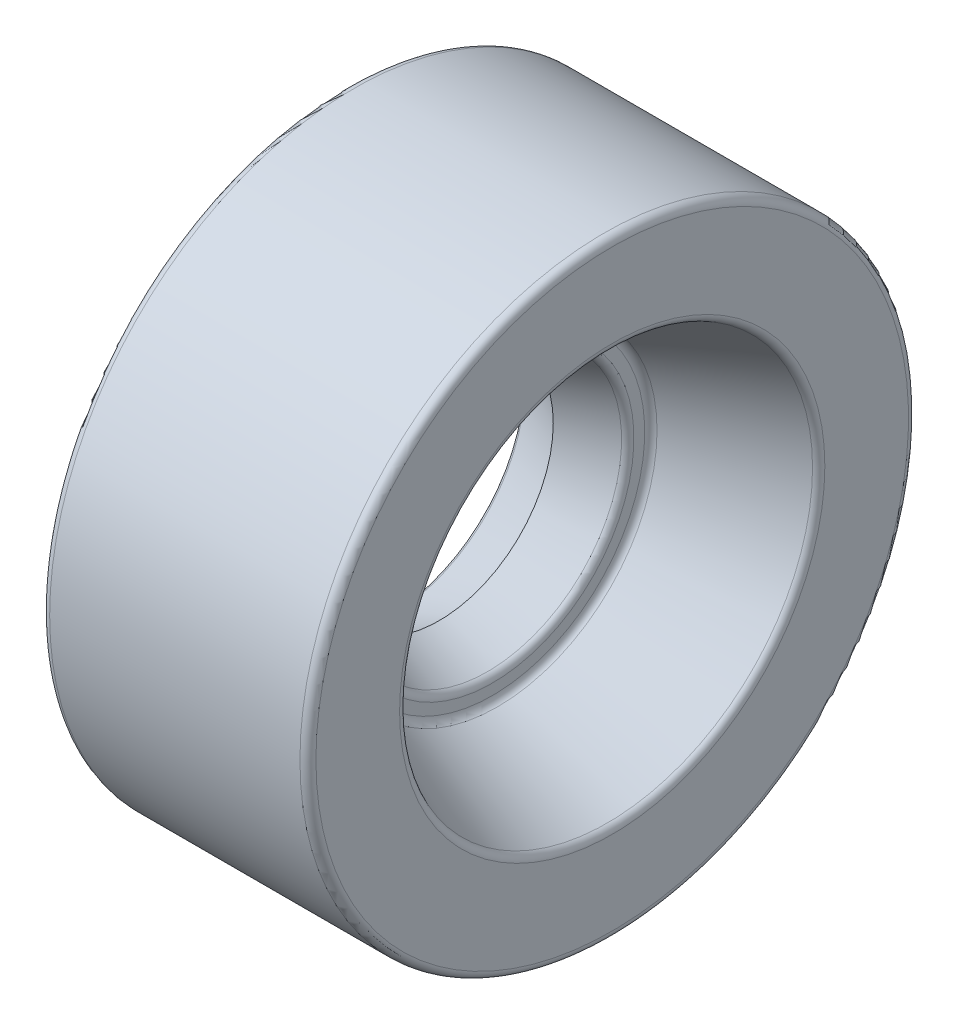
ISO-10303-21;
HEADER;
FILE_DESCRIPTION(('STEP AP214'),'2;1');
FILE_NAME('part.step','',(''),(''),'','','');
FILE_SCHEMA(('AUTOMOTIVE_DESIGN { 1 0 10303 214 1 1 1 1 }'));
ENDSEC;
DATA;
#1=APPLICATION_CONTEXT('core data for automotive mechanical design processes');
#2=APPLICATION_PROTOCOL_DEFINITION('international standard','automotive_design',2000,#1);
#3=PRODUCT_CONTEXT('',#1,'mechanical');
#4=PRODUCT('Part','Part','',(#3));
#5=PRODUCT_RELATED_PRODUCT_CATEGORY('part','',(#4));
#6=PRODUCT_DEFINITION_FORMATION('','',#4);
#7=PRODUCT_DEFINITION_CONTEXT('part definition',#1,'design');
#8=PRODUCT_DEFINITION('design','',#6,#7);
#9=PRODUCT_DEFINITION_SHAPE('','',#8);
#10=(LENGTH_UNIT() NAMED_UNIT(*) SI_UNIT(.MILLI.,.METRE.));
#11=(NAMED_UNIT(*) PLANE_ANGLE_UNIT() SI_UNIT($,.RADIAN.));
#12=(NAMED_UNIT(*) SI_UNIT($,.STERADIAN.) SOLID_ANGLE_UNIT());
#13=UNCERTAINTY_MEASURE_WITH_UNIT(LENGTH_MEASURE(1.E-05),#10,'distance_accuracy_value','');
#14=(GEOMETRIC_REPRESENTATION_CONTEXT(3) GLOBAL_UNCERTAINTY_ASSIGNED_CONTEXT((#13)) GLOBAL_UNIT_ASSIGNED_CONTEXT((#10,
#11,#12)) REPRESENTATION_CONTEXT('',''));
#15=CARTESIAN_POINT('',(0.,0.,0.));
#16=DIRECTION('',(0.,0.,1.));
#17=DIRECTION('',(1.,0.,0.));
#18=AXIS2_PLACEMENT_3D('',#15,#16,#17);
#19=CARTESIAN_POINT('',(0.,0.,0.));
#20=DIRECTION('',(-1.,0.,0.));
#21=DIRECTION('',(0.,0.,1.));
#22=AXIS2_PLACEMENT_3D('',#19,#20,#21);
#23=TOROIDAL_SURFACE('',#22,4.75,0.105);
#24=CARTESIAN_POINT('',(0.,0.,4.855));
#25=VERTEX_POINT('',#24);
#26=VERTEX_LOOP('',#25);
#27=FACE_BOUND('',#26,.T.);
#28=ADVANCED_FACE('F35',(#27),#23,.T.);
#29=CLOSED_SHELL('',(#28));
#30=MANIFOLD_SOLID_BREP('B2',#29);
#31=CARTESIAN_POINT('',(0.,0.,0.));
#32=DIRECTION('',(-1.,0.,0.));
#33=DIRECTION('',(0.,0.,1.));
#34=AXIS2_PLACEMENT_3D('',#31,#32,#33);
#35=TOROIDAL_SURFACE('',#34,4.75,0.525);
#36=CARTESIAN_POINT('',(0.,0.,5.275));
#37=VERTEX_POINT('',#36);
#38=VERTEX_LOOP('',#37);
#39=FACE_BOUND('',#38,.T.);
#40=ADVANCED_FACE('F55',(#39),#35,.T.);
#41=CLOSED_SHELL('',(#40));
#42=CARTESIAN_POINT('',(0.,0.,0.));
#43=DIRECTION('',(-1.,0.,0.));
#44=DIRECTION('',(0.,0.,1.));
#45=AXIS2_PLACEMENT_3D('',#42,#43,#44);
#46=TOROIDAL_SURFACE('',#45,4.75,0.42551639);
#47=CARTESIAN_POINT('',(0.,0.,5.17551639));
#48=VERTEX_POINT('',#47);
#49=VERTEX_LOOP('',#48);
#50=FACE_BOUND('',#49,.T.);
#51=ADVANCED_FACE('F68',(#50),#46,.F.);
#52=CLOSED_SHELL('',(#51));
#53=ORIENTED_CLOSED_SHELL('',*,#52,.T.);
#54=BREP_WITH_VOIDS('B6',#41,(#53));
#55=CARTESIAN_POINT('',(-2.45,6.95,0.));
#56=DIRECTION('',(1.,0.,0.));
#57=DIRECTION('',(0.,0.,-1.));
#58=AXIS2_PLACEMENT_3D('',#55,#56,#57);
#59=PLANE('',#58);
#60=CARTESIAN_POINT('',(-2.45,0.,0.));
#61=DIRECTION('',(1.,0.,0.));
#62=DIRECTION('',(0.,0.,-1.));
#63=AXIS2_PLACEMENT_3D('',#60,#61,#62);
#64=CIRCLE('',#63,7.14928255901013);
#65=CARTESIAN_POINT('',(-2.45,0.,-7.14928255901013));
#66=VERTEX_POINT('',#65);
#67=EDGE_CURVE('E96',#66,#66,#64,.T.);
#68=ORIENTED_EDGE('',*,*,#67,.T.);
#69=EDGE_LOOP('',(#68));
#70=FACE_BOUND('',#69,.T.);
#71=CARTESIAN_POINT('',(-2.45,0.,0.));
#72=DIRECTION('',(1.,0.,0.));
#73=DIRECTION('',(0.,0.,-1.));
#74=AXIS2_PLACEMENT_3D('',#71,#72,#73);
#75=CIRCLE('',#74,7.79);
#76=CARTESIAN_POINT('',(-2.45,0.,-7.79));
#77=VERTEX_POINT('',#76);
#78=EDGE_CURVE('E99',#77,#77,#75,.F.);
#79=ORIENTED_EDGE('',*,*,#78,.T.);
#80=EDGE_LOOP('',(#79));
#81=FACE_BOUND('',#80,.T.);
#82=ADVANCED_FACE('F77',(#70,#81),#59,.F.);
#83=CARTESIAN_POINT('',(-2.45,0.,0.));
#84=DIRECTION('',(-1.,0.,0.));
#85=DIRECTION('',(0.,0.,1.));
#86=AXIS2_PLACEMENT_3D('',#83,#84,#85);
#87=CONICAL_SURFACE('',#86,6.95,0.052359877559823);
#88=CARTESIAN_POINT('',(3.30099055081102,0.,0.));
#89=DIRECTION('',(-1.,0.,0.));
#90=DIRECTION('',(0.,0.,1.));
#91=AXIS2_PLACEMENT_3D('',#88,#89,#90);
#92=CIRCLE('',#91,6.64860335655428);
#93=CARTESIAN_POINT('',(3.30099055081102,0.,6.64860335655428));
#94=VERTEX_POINT('',#93);
#95=EDGE_CURVE('E102',#94,#94,#92,.F.);
#96=ORIENTED_EDGE('',*,*,#95,.T.);
#97=EDGE_LOOP('',(#96));
#98=FACE_BOUND('',#97,.T.);
#99=CARTESIAN_POINT('',(-2.25099055081104,0.,0.));
#100=DIRECTION('',(1.,0.,0.));
#101=DIRECTION('',(0.,0.,-1.));
#102=AXIS2_PLACEMENT_3D('',#99,#100,#101);
#103=CIRCLE('',#102,6.93957035671167);
#104=CARTESIAN_POINT('',(-2.25099055081104,0.,-6.93957035671167));
#105=VERTEX_POINT('',#104);
#106=EDGE_CURVE('E105',#105,#105,#103,.F.);
#107=ORIENTED_EDGE('',*,*,#106,.T.);
#108=EDGE_LOOP('',(#107));
#109=FACE_BOUND('',#108,.T.);
#110=ADVANCED_FACE('F178',(#98,#109),#87,.F.);
#111=CARTESIAN_POINT('',(3.5,5.69698284569246,0.));
#112=DIRECTION('',(1.,0.,0.));
#113=DIRECTION('',(0.,0.,-1.));
#114=AXIS2_PLACEMENT_3D('',#111,#112,#113);
#115=PLANE('',#114);
#116=CARTESIAN_POINT('',(3.5,0.,0.));
#117=DIRECTION('',(1.,0.,0.));
#118=DIRECTION('',(0.,0.,-1.));
#119=AXIS2_PLACEMENT_3D('',#116,#117,#118);
#120=CIRCLE('',#119,5.83730035965551);
#121=CARTESIAN_POINT('',(3.5,0.,-5.83730035965551));
#122=VERTEX_POINT('',#121);
#123=EDGE_CURVE('E108',#122,#122,#120,.T.);
#124=ORIENTED_EDGE('',*,*,#123,.T.);
#125=EDGE_LOOP('',(#124));
#126=FACE_BOUND('',#125,.T.);
#127=CARTESIAN_POINT('',(3.5,0.,0.));
#128=DIRECTION('',(1.,0.,0.));
#129=DIRECTION('',(0.,0.,-1.));
#130=AXIS2_PLACEMENT_3D('',#127,#128,#129);
#131=CIRCLE('',#130,6.43889115425582);
#132=CARTESIAN_POINT('',(3.5,0.,-6.43889115425582));
#133=VERTEX_POINT('',#132);
#134=EDGE_CURVE('E111',#133,#133,#131,.F.);
#135=ORIENTED_EDGE('',*,*,#134,.T.);
#136=EDGE_LOOP('',(#135));
#137=FACE_BOUND('',#136,.T.);
#138=ADVANCED_FACE('F184',(#126,#137),#115,.F.);
#139=CARTESIAN_POINT('',(3.5,0.,0.));
#140=DIRECTION('',(1.,0.,0.));
#141=DIRECTION('',(0.,0.,-1.));
#142=AXIS2_PLACEMENT_3D('',#139,#140,#141);
#143=CONICAL_SURFACE('',#142,5.69698284569246,0.392699081698725);
#144=CARTESIAN_POINT('',(1.25237309424155,0.,0.));
#145=DIRECTION('',(1.,0.,0.));
#146=DIRECTION('',(0.,0.,-1.));
#147=AXIS2_PLACEMENT_3D('',#144,#145,#146);
#148=CIRCLE('',#147,4.76598529817263);
#149=CARTESIAN_POINT('',(1.25237309424155,0.,-4.76598529817263));
#150=VERTEX_POINT('',#149);
#151=EDGE_CURVE('E114',#150,#150,#148,.T.);
#152=ORIENTED_EDGE('',*,*,#151,.T.);
#153=EDGE_LOOP('',(#152));
#154=FACE_BOUND('',#153,.T.);
#155=CARTESIAN_POINT('',(3.37036352079667,0.,0.));
#156=DIRECTION('',(1.,0.,0.));
#157=DIRECTION('',(0.,0.,-1.));
#158=AXIS2_PLACEMENT_3D('',#155,#156,#157);
#159=CIRCLE('',#158,5.64328565782814);
#160=CARTESIAN_POINT('',(3.37036352079667,0.,-5.64328565782814));
#161=VERTEX_POINT('',#160);
#162=EDGE_CURVE('E117',#161,#161,#159,.F.);
#163=ORIENTED_EDGE('',*,*,#162,.T.);
#164=EDGE_LOOP('',(#163));
#165=FACE_BOUND('',#164,.T.);
#166=ADVANCED_FACE('F351',(#154,#165),#143,.T.);
#167=CARTESIAN_POINT('',(0.,0.,0.));
#168=DIRECTION('',(-1.,0.,0.));
#169=DIRECTION('',(0.,0.,1.));
#170=AXIS2_PLACEMENT_3D('',#167,#168,#169);
#171=CYLINDRICAL_SURFACE('',#170,4.75);
#172=CARTESIAN_POINT('',(1.17200957344488,0.,0.));
#173=DIRECTION('',(-1.,0.,0.));
#174=DIRECTION('',(0.,0.,1.));
#175=AXIS2_PLACEMENT_3D('',#172,#173,#174);
#176=CIRCLE('',#175,4.75);
#177=CARTESIAN_POINT('',(1.17200957344488,0.,4.75));
#178=VERTEX_POINT('',#177);
#179=EDGE_CURVE('E120',#178,#178,#176,.T.);
#180=ORIENTED_EDGE('',*,*,#179,.T.);
#181=EDGE_LOOP('',(#180));
#182=FACE_BOUND('',#181,.T.);
#183=CARTESIAN_POINT('',(0.525,0.,0.));
#184=DIRECTION('',(-1.,0.,0.));
#185=DIRECTION('',(0.,0.,1.));
#186=AXIS2_PLACEMENT_3D('',#183,#184,#185);
#187=CIRCLE('',#186,4.75);
#188=CARTESIAN_POINT('',(0.525,0.,4.75));
#189=VERTEX_POINT('',#188);
#190=EDGE_CURVE('E150',#189,#189,#187,.T.);
#191=ORIENTED_EDGE('',*,*,#190,.F.);
#192=EDGE_LOOP('',(#191));
#193=FACE_BOUND('',#192,.T.);
#194=ADVANCED_FACE('F344',(#182,#193),#171,.T.);
#195=CARTESIAN_POINT('',(0.,0.,0.));
#196=DIRECTION('',(-1.,0.,0.));
#197=DIRECTION('',(0.,0.,1.));
#198=AXIS2_PLACEMENT_3D('',#195,#196,#197);
#199=TOROIDAL_SURFACE('',#198,4.75,0.525);
#200=CARTESIAN_POINT('',(-0.525,0.,0.));
#201=DIRECTION('',(-1.,0.,0.));
#202=DIRECTION('',(0.,0.,1.));
#203=AXIS2_PLACEMENT_3D('',#200,#201,#202);
#204=CIRCLE('',#203,4.75);
#205=CARTESIAN_POINT('',(-0.525,0.,4.75));
#206=VERTEX_POINT('',#205);
#207=EDGE_CURVE('E153',#206,#206,#204,.T.);
#208=ORIENTED_EDGE('',*,*,#207,.F.);
#209=EDGE_LOOP('',(#208));
#210=FACE_BOUND('',#209,.T.);
#211=ORIENTED_EDGE('',*,*,#190,.T.);
#212=EDGE_LOOP('',(#211));
#213=FACE_BOUND('',#212,.T.);
#214=ADVANCED_FACE('F336',(#210,#213),#199,.F.);
#215=CARTESIAN_POINT('',(0.,0.,0.));
#216=DIRECTION('',(-1.,0.,0.));
#217=DIRECTION('',(0.,0.,1.));
#218=AXIS2_PLACEMENT_3D('',#215,#216,#217);
#219=CYLINDRICAL_SURFACE('',#218,4.75);
#220=CARTESIAN_POINT('',(-1.19,0.,0.));
#221=DIRECTION('',(1.,0.,0.));
#222=DIRECTION('',(0.,0.,-1.));
#223=AXIS2_PLACEMENT_3D('',#220,#221,#222);
#224=CIRCLE('',#223,4.75);
#225=CARTESIAN_POINT('',(-1.19,0.,-4.75));
#226=VERTEX_POINT('',#225);
#227=EDGE_CURVE('E123',#226,#226,#224,.T.);
#228=ORIENTED_EDGE('',*,*,#227,.T.);
#229=EDGE_LOOP('',(#228));
#230=FACE_BOUND('',#229,.T.);
#231=ORIENTED_EDGE('',*,*,#207,.T.);
#232=EDGE_LOOP('',(#231));
#233=FACE_BOUND('',#232,.T.);
#234=ADVANCED_FACE('F174',(#230,#233),#219,.T.);
#235=CARTESIAN_POINT('',(-1.4,3.57989898732233,0.));
#236=DIRECTION('',(1.,0.,0.));
#237=DIRECTION('',(0.,0.,-1.));
#238=AXIS2_PLACEMENT_3D('',#235,#236,#237);
#239=PLANE('',#238);
#240=CARTESIAN_POINT('',(-1.4,0.,0.));
#241=DIRECTION('',(1.,0.,0.));
#242=DIRECTION('',(0.,0.,-1.));
#243=AXIS2_PLACEMENT_3D('',#240,#241,#242);
#244=CIRCLE('',#243,3.72021650128539);
#245=CARTESIAN_POINT('',(-1.4,0.,-3.72021650128539));
#246=VERTEX_POINT('',#245);
#247=EDGE_CURVE('E126',#246,#246,#244,.T.);
#248=ORIENTED_EDGE('',*,*,#247,.T.);
#249=EDGE_LOOP('',(#248));
#250=FACE_BOUND('',#249,.T.);
#251=CARTESIAN_POINT('',(-1.4,0.,0.));
#252=DIRECTION('',(1.,0.,0.));
#253=DIRECTION('',(0.,0.,-1.));
#254=AXIS2_PLACEMENT_3D('',#251,#252,#253);
#255=CIRCLE('',#254,4.54);
#256=CARTESIAN_POINT('',(-1.4,0.,-4.54));
#257=VERTEX_POINT('',#256);
#258=EDGE_CURVE('E129',#257,#257,#255,.F.);
#259=ORIENTED_EDGE('',*,*,#258,.T.);
#260=EDGE_LOOP('',(#259));
#261=FACE_BOUND('',#260,.T.);
#262=ADVANCED_FACE('F164',(#250,#261),#239,.F.);
#263=CARTESIAN_POINT('',(-1.4,0.,0.));
#264=DIRECTION('',(-1.,0.,0.));
#265=DIRECTION('',(0.,0.,1.));
#266=AXIS2_PLACEMENT_3D('',#263,#264,#265);
#267=CONICAL_SURFACE('',#266,3.57989898732233,0.392699081698725);
#268=CARTESIAN_POINT('',(-1.27036352079667,0.,0.));
#269=DIRECTION('',(1.,0.,0.));
#270=DIRECTION('',(0.,0.,-1.));
#271=AXIS2_PLACEMENT_3D('',#268,#269,#270);
#272=CIRCLE('',#271,3.52620179945802);
#273=CARTESIAN_POINT('',(-1.27036352079667,0.,-3.52620179945802));
#274=VERTEX_POINT('',#273);
#275=EDGE_CURVE('E132',#274,#274,#272,.F.);
#276=ORIENTED_EDGE('',*,*,#275,.T.);
#277=EDGE_LOOP('',(#276));
#278=FACE_BOUND('',#277,.T.);
#279=CARTESIAN_POINT('',(0.,0.,0.));
#280=DIRECTION('',(-1.,0.,0.));
#281=DIRECTION('',(0.,0.,1.));
#282=AXIS2_PLACEMENT_3D('',#279,#280,#281);
#283=CIRCLE('',#282,3.);
#284=CARTESIAN_POINT('',(0.,0.,3.));
#285=VERTEX_POINT('',#284);
#286=EDGE_CURVE('E156',#285,#285,#283,.T.);
#287=ORIENTED_EDGE('',*,*,#286,.F.);
#288=EDGE_LOOP('',(#287));
#289=FACE_BOUND('',#288,.T.);
#290=ADVANCED_FACE('F162',(#278,#289),#267,.F.);
#291=CARTESIAN_POINT('',(0.,0.,0.));
#292=DIRECTION('',(1.,0.,0.));
#293=DIRECTION('',(0.,0.,-1.));
#294=AXIS2_PLACEMENT_3D('',#291,#292,#293);
#295=CONICAL_SURFACE('',#294,3.,0.392699081698726);
#296=CARTESIAN_POINT('',(1.27036352079667,0.,0.));
#297=DIRECTION('',(-1.,0.,0.));
#298=DIRECTION('',(0.,0.,1.));
#299=AXIS2_PLACEMENT_3D('',#296,#297,#298);
#300=CIRCLE('',#299,3.52620179945802);
#301=CARTESIAN_POINT('',(1.27036352079667,0.,3.52620179945802));
#302=VERTEX_POINT('',#301);
#303=EDGE_CURVE('E135',#302,#302,#300,.F.);
#304=ORIENTED_EDGE('',*,*,#303,.T.);
#305=EDGE_LOOP('',(#304));
#306=FACE_BOUND('',#305,.T.);
#307=ORIENTED_EDGE('',*,*,#286,.T.);
#308=EDGE_LOOP('',(#307));
#309=FACE_BOUND('',#308,.T.);
#310=ADVANCED_FACE('F160',(#306,#309),#295,.F.);
#311=CARTESIAN_POINT('',(1.4,4.14522727852475,0.));
#312=DIRECTION('',(-1.,0.,0.));
#313=DIRECTION('',(0.,0.,1.));
#314=AXIS2_PLACEMENT_3D('',#311,#312,#313);
#315=PLANE('',#314);
#316=CARTESIAN_POINT('',(1.4,0.,0.));
#317=DIRECTION('',(-1.,0.,0.));
#318=DIRECTION('',(0.,0.,1.));
#319=AXIS2_PLACEMENT_3D('',#316,#317,#318);
#320=CIRCLE('',#319,4.00490976456169);
#321=CARTESIAN_POINT('',(1.4,0.,4.00490976456169));
#322=VERTEX_POINT('',#321);
#323=EDGE_CURVE('E138',#322,#322,#320,.F.);
#324=ORIENTED_EDGE('',*,*,#323,.T.);
#325=EDGE_LOOP('',(#324));
#326=FACE_BOUND('',#325,.T.);
#327=CARTESIAN_POINT('',(1.4,0.,0.));
#328=DIRECTION('',(-1.,0.,0.));
#329=DIRECTION('',(0.,0.,1.));
#330=AXIS2_PLACEMENT_3D('',#327,#328,#329);
#331=CIRCLE('',#330,3.72021650128539);
#332=CARTESIAN_POINT('',(1.4,0.,3.72021650128539));
#333=VERTEX_POINT('',#332);
#334=EDGE_CURVE('E141',#333,#333,#331,.T.);
#335=ORIENTED_EDGE('',*,*,#334,.T.);
#336=EDGE_LOOP('',(#335));
#337=FACE_BOUND('',#336,.T.);
#338=ADVANCED_FACE('F171',(#326,#337),#315,.F.);
#339=CARTESIAN_POINT('',(1.4,0.,0.));
#340=DIRECTION('',(1.,0.,0.));
#341=DIRECTION('',(0.,0.,-1.));
#342=AXIS2_PLACEMENT_3D('',#339,#340,#341);
#343=CONICAL_SURFACE('',#342,4.14522727852475,0.392699081698725);
#344=CARTESIAN_POINT('',(1.52963647920333,0.,0.));
#345=DIRECTION('',(1.,0.,0.));
#346=DIRECTION('',(0.,0.,-1.));
#347=AXIS2_PLACEMENT_3D('',#344,#345,#346);
#348=CIRCLE('',#347,4.19892446638906);
#349=CARTESIAN_POINT('',(1.52963647920333,0.,-4.19892446638906));
#350=VERTEX_POINT('',#349);
#351=EDGE_CURVE('E144',#350,#350,#348,.F.);
#352=ORIENTED_EDGE('',*,*,#351,.T.);
#353=EDGE_LOOP('',(#352));
#354=FACE_BOUND('',#353,.T.);
#355=CARTESIAN_POINT('',(4.42036352079667,0.,0.));
#356=DIRECTION('',(-1.,0.,0.));
#357=DIRECTION('',(0.,0.,1.));
#358=AXIS2_PLACEMENT_3D('',#355,#356,#357);
#359=CIRCLE('',#358,5.39630281213568);
#360=CARTESIAN_POINT('',(4.42036352079667,0.,5.39630281213568));
#361=VERTEX_POINT('',#360);
#362=EDGE_CURVE('E147',#361,#361,#359,.F.);
#363=ORIENTED_EDGE('',*,*,#362,.T.);
#364=EDGE_LOOP('',(#363));
#365=FACE_BOUND('',#364,.T.);
#366=ADVANCED_FACE('F243',(#354,#365),#343,.F.);
#367=CARTESIAN_POINT('',(4.55,8.,0.));
#368=DIRECTION('',(-1.,0.,0.));
#369=DIRECTION('',(0.,0.,1.));
#370=AXIS2_PLACEMENT_3D('',#367,#368,#369);
#371=PLANE('',#370);
#372=CARTESIAN_POINT('',(4.55,0.,0.));
#373=DIRECTION('',(-1.,0.,0.));
#374=DIRECTION('',(0.,0.,1.));
#375=AXIS2_PLACEMENT_3D('',#372,#373,#374);
#376=CIRCLE('',#375,5.59031751396305);
#377=CARTESIAN_POINT('',(4.55,0.,5.59031751396305));
#378=VERTEX_POINT('',#377);
#379=EDGE_CURVE('E53',#378,#378,#376,.T.);
#380=ORIENTED_EDGE('',*,*,#379,.T.);
#381=EDGE_LOOP('',(#380));
#382=FACE_BOUND('',#381,.T.);
#383=CARTESIAN_POINT('',(4.55,0.,0.));
#384=DIRECTION('',(-1.,0.,0.));
#385=DIRECTION('',(0.,0.,1.));
#386=AXIS2_PLACEMENT_3D('',#383,#384,#385);
#387=CIRCLE('',#386,7.79);
#388=CARTESIAN_POINT('',(4.55,0.,7.79));
#389=VERTEX_POINT('',#388);
#390=EDGE_CURVE('E83',#389,#389,#387,.F.);
#391=ORIENTED_EDGE('',*,*,#390,.T.);
#392=EDGE_LOOP('',(#391));
#393=FACE_BOUND('',#392,.T.);
#394=ADVANCED_FACE('F239',(#382,#393),#371,.F.);
#395=CARTESIAN_POINT('',(0.,0.,0.));
#396=DIRECTION('',(-1.,0.,0.));
#397=DIRECTION('',(0.,0.,1.));
#398=AXIS2_PLACEMENT_3D('',#395,#396,#397);
#399=CYLINDRICAL_SURFACE('',#398,8.);
#400=CARTESIAN_POINT('',(-2.24,0.,0.));
#401=DIRECTION('',(1.,0.,0.));
#402=DIRECTION('',(0.,0.,-1.));
#403=AXIS2_PLACEMENT_3D('',#400,#401,#402);
#404=CIRCLE('',#403,8.);
#405=CARTESIAN_POINT('',(-2.24,0.,-8.));
#406=VERTEX_POINT('',#405);
#407=EDGE_CURVE('E87',#406,#406,#404,.T.);
#408=ORIENTED_EDGE('',*,*,#407,.T.);
#409=EDGE_LOOP('',(#408));
#410=FACE_BOUND('',#409,.T.);
#411=CARTESIAN_POINT('',(4.34,0.,0.));
#412=DIRECTION('',(-1.,0.,0.));
#413=DIRECTION('',(0.,0.,1.));
#414=AXIS2_PLACEMENT_3D('',#411,#412,#413);
#415=CIRCLE('',#414,8.);
#416=CARTESIAN_POINT('',(4.34,0.,8.));
#417=VERTEX_POINT('',#416);
#418=EDGE_CURVE('E91',#417,#417,#415,.T.);
#419=ORIENTED_EDGE('',*,*,#418,.T.);
#420=EDGE_LOOP('',(#419));
#421=FACE_BOUND('',#420,.T.);
#422=ADVANCED_FACE('F235',(#410,#421),#399,.T.);
#423=CARTESIAN_POINT('',(1.61,0.,0.));
#424=DIRECTION('',(-1.,0.,0.));
#425=DIRECTION('',(0.,0.,1.));
#426=AXIS2_PLACEMENT_3D('',#423,#424,#425);
#427=TOROIDAL_SURFACE('',#426,4.00490976456169,0.21);
#428=ORIENTED_EDGE('',*,*,#323,.F.);
#429=EDGE_LOOP('',(#428));
#430=FACE_BOUND('',#429,.T.);
#431=ORIENTED_EDGE('',*,*,#351,.F.);
#432=EDGE_LOOP('',(#431));
#433=FACE_BOUND('',#432,.T.);
#434=ADVANCED_FACE('F231',(#430,#433),#427,.F.);
#435=CARTESIAN_POINT('',(1.19,0.,0.));
#436=DIRECTION('',(-1.,0.,0.));
#437=DIRECTION('',(0.,0.,1.));
#438=AXIS2_PLACEMENT_3D('',#435,#436,#437);
#439=TOROIDAL_SURFACE('',#438,3.72021650128539,0.21);
#440=ORIENTED_EDGE('',*,*,#303,.F.);
#441=EDGE_LOOP('',(#440));
#442=FACE_BOUND('',#441,.T.);
#443=ORIENTED_EDGE('',*,*,#334,.F.);
#444=EDGE_LOOP('',(#443));
#445=FACE_BOUND('',#444,.T.);
#446=ADVANCED_FACE('F227',(#442,#445),#439,.T.);
#447=CARTESIAN_POINT('',(-1.19,0.,0.));
#448=DIRECTION('',(1.,0.,0.));
#449=DIRECTION('',(0.,0.,-1.));
#450=AXIS2_PLACEMENT_3D('',#447,#448,#449);
#451=TOROIDAL_SURFACE('',#450,3.72021650128539,0.21);
#452=ORIENTED_EDGE('',*,*,#247,.F.);
#453=EDGE_LOOP('',(#452));
#454=FACE_BOUND('',#453,.T.);
#455=ORIENTED_EDGE('',*,*,#275,.F.);
#456=EDGE_LOOP('',(#455));
#457=FACE_BOUND('',#456,.T.);
#458=ADVANCED_FACE('F223',(#454,#457),#451,.T.);
#459=CARTESIAN_POINT('',(-1.19,0.,0.));
#460=DIRECTION('',(1.,0.,0.));
#461=DIRECTION('',(0.,0.,-1.));
#462=AXIS2_PLACEMENT_3D('',#459,#460,#461);
#463=TOROIDAL_SURFACE('',#462,4.54,0.21);
#464=ORIENTED_EDGE('',*,*,#227,.F.);
#465=EDGE_LOOP('',(#464));
#466=FACE_BOUND('',#465,.T.);
#467=ORIENTED_EDGE('',*,*,#258,.F.);
#468=EDGE_LOOP('',(#467));
#469=FACE_BOUND('',#468,.T.);
#470=ADVANCED_FACE('F219',(#466,#469),#463,.T.);
#471=CARTESIAN_POINT('',(1.17200957344488,0.,0.));
#472=DIRECTION('',(-1.,0.,0.));
#473=DIRECTION('',(0.,0.,1.));
#474=AXIS2_PLACEMENT_3D('',#471,#472,#473);
#475=TOROIDAL_SURFACE('',#474,4.96,0.21);
#476=ORIENTED_EDGE('',*,*,#151,.F.);
#477=EDGE_LOOP('',(#476));
#478=FACE_BOUND('',#477,.T.);
#479=ORIENTED_EDGE('',*,*,#179,.F.);
#480=EDGE_LOOP('',(#479));
#481=FACE_BOUND('',#480,.T.);
#482=ADVANCED_FACE('F215',(#478,#481),#475,.F.);
#483=CARTESIAN_POINT('',(3.29,0.,0.));
#484=DIRECTION('',(1.,0.,0.));
#485=DIRECTION('',(0.,0.,-1.));
#486=AXIS2_PLACEMENT_3D('',#483,#484,#485);
#487=TOROIDAL_SURFACE('',#486,5.83730035965551,0.21);
#488=ORIENTED_EDGE('',*,*,#123,.F.);
#489=EDGE_LOOP('',(#488));
#490=FACE_BOUND('',#489,.T.);
#491=ORIENTED_EDGE('',*,*,#162,.F.);
#492=EDGE_LOOP('',(#491));
#493=FACE_BOUND('',#492,.T.);
#494=ADVANCED_FACE('F211',(#490,#493),#487,.F.);
#495=CARTESIAN_POINT('',(3.29,0.,0.));
#496=DIRECTION('',(1.,0.,0.));
#497=DIRECTION('',(0.,0.,-1.));
#498=AXIS2_PLACEMENT_3D('',#495,#496,#497);
#499=TOROIDAL_SURFACE('',#498,6.43889115425582,0.21);
#500=ORIENTED_EDGE('',*,*,#95,.F.);
#501=EDGE_LOOP('',(#500));
#502=FACE_BOUND('',#501,.T.);
#503=ORIENTED_EDGE('',*,*,#134,.F.);
#504=EDGE_LOOP('',(#503));
#505=FACE_BOUND('',#504,.T.);
#506=ADVANCED_FACE('F203',(#502,#505),#499,.F.);
#507=CARTESIAN_POINT('',(-2.24,0.,0.));
#508=DIRECTION('',(1.,0.,0.));
#509=DIRECTION('',(0.,0.,-1.));
#510=AXIS2_PLACEMENT_3D('',#507,#508,#509);
#511=TOROIDAL_SURFACE('',#510,7.14928255901013,0.21);
#512=ORIENTED_EDGE('',*,*,#67,.F.);
#513=EDGE_LOOP('',(#512));
#514=FACE_BOUND('',#513,.T.);
#515=ORIENTED_EDGE('',*,*,#106,.F.);
#516=EDGE_LOOP('',(#515));
#517=FACE_BOUND('',#516,.T.);
#518=ADVANCED_FACE('F193',(#514,#517),#511,.T.);
#519=CARTESIAN_POINT('',(-2.24,0.,0.));
#520=DIRECTION('',(1.,0.,0.));
#521=DIRECTION('',(0.,0.,-1.));
#522=AXIS2_PLACEMENT_3D('',#519,#520,#521);
#523=TOROIDAL_SURFACE('',#522,7.79,0.21);
#524=ORIENTED_EDGE('',*,*,#407,.F.);
#525=EDGE_LOOP('',(#524));
#526=FACE_BOUND('',#525,.T.);
#527=ORIENTED_EDGE('',*,*,#78,.F.);
#528=EDGE_LOOP('',(#527));
#529=FACE_BOUND('',#528,.T.);
#530=ADVANCED_FACE('F190',(#526,#529),#523,.T.);
#531=CARTESIAN_POINT('',(4.34,0.,0.));
#532=DIRECTION('',(-1.,0.,0.));
#533=DIRECTION('',(0.,0.,1.));
#534=AXIS2_PLACEMENT_3D('',#531,#532,#533);
#535=TOROIDAL_SURFACE('',#534,5.59031751396305,0.21);
#536=ORIENTED_EDGE('',*,*,#362,.F.);
#537=EDGE_LOOP('',(#536));
#538=FACE_BOUND('',#537,.T.);
#539=ORIENTED_EDGE('',*,*,#379,.F.);
#540=EDGE_LOOP('',(#539));
#541=FACE_BOUND('',#540,.T.);
#542=ADVANCED_FACE('F192',(#538,#541),#535,.T.);
#543=CARTESIAN_POINT('',(4.34,0.,0.));
#544=DIRECTION('',(-1.,0.,0.));
#545=DIRECTION('',(0.,0.,1.));
#546=AXIS2_PLACEMENT_3D('',#543,#544,#545);
#547=TOROIDAL_SURFACE('',#546,7.79,0.21);
#548=ORIENTED_EDGE('',*,*,#390,.F.);
#549=EDGE_LOOP('',(#548));
#550=FACE_BOUND('',#549,.T.);
#551=ORIENTED_EDGE('',*,*,#418,.F.);
#552=EDGE_LOOP('',(#551));
#553=FACE_BOUND('',#552,.T.);
#554=ADVANCED_FACE('F200',(#550,#553),#547,.T.);
#555=CLOSED_SHELL('',(#82,#110,#138,#166,#194,#214,#234,#262,#290,#310,#338,#366,#394,#422,#434,
#446,#458,#470,#482,#494,#506,#518,#530,#542,#554));
#556=MANIFOLD_SOLID_BREP('B31',#555);
#557=ADVANCED_BREP_SHAPE_REPRESENTATION('',(#18,#30,#54,#556),#14);
#558=SHAPE_DEFINITION_REPRESENTATION(#9,#557);
ENDSEC;
END-ISO-10303-21;
